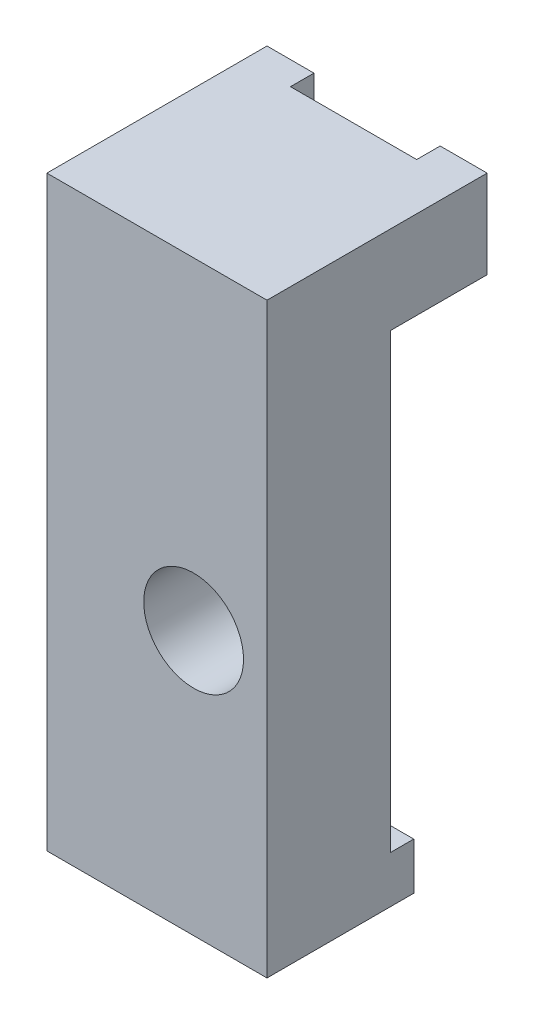
ISO-10303-21;
HEADER;
FILE_DESCRIPTION(('STEP AP214'),'2;1');
FILE_NAME('part.step','',(''),(''),'','','');
FILE_SCHEMA(('AUTOMOTIVE_DESIGN { 1 0 10303 214 1 1 1 1 }'));
ENDSEC;
DATA;
#1=APPLICATION_CONTEXT('core data for automotive mechanical design processes');
#2=APPLICATION_PROTOCOL_DEFINITION('international standard','automotive_design',2000,#1);
#3=PRODUCT_CONTEXT('',#1,'mechanical');
#4=PRODUCT('Part','Part','',(#3));
#5=PRODUCT_RELATED_PRODUCT_CATEGORY('part','',(#4));
#6=PRODUCT_DEFINITION_FORMATION('','',#4);
#7=PRODUCT_DEFINITION_CONTEXT('part definition',#1,'design');
#8=PRODUCT_DEFINITION('design','',#6,#7);
#9=PRODUCT_DEFINITION_SHAPE('','',#8);
#10=(LENGTH_UNIT() NAMED_UNIT(*) SI_UNIT(.MILLI.,.METRE.));
#11=(NAMED_UNIT(*) PLANE_ANGLE_UNIT() SI_UNIT($,.RADIAN.));
#12=(NAMED_UNIT(*) SI_UNIT($,.STERADIAN.) SOLID_ANGLE_UNIT());
#13=UNCERTAINTY_MEASURE_WITH_UNIT(LENGTH_MEASURE(1.E-05),#10,'distance_accuracy_value','');
#14=(GEOMETRIC_REPRESENTATION_CONTEXT(3) GLOBAL_UNCERTAINTY_ASSIGNED_CONTEXT((#13)) GLOBAL_UNIT_ASSIGNED_CONTEXT((#10,
#11,#12)) REPRESENTATION_CONTEXT('',''));
#15=CARTESIAN_POINT('',(0.,0.,0.));
#16=DIRECTION('',(0.,0.,1.));
#17=DIRECTION('',(1.,0.,0.));
#18=AXIS2_PLACEMENT_3D('',#15,#16,#17);
#19=CARTESIAN_POINT('',(0.,0.,-4.7625));
#20=DIRECTION('',(0.,0.,1.));
#21=DIRECTION('',(1.,0.,0.));
#22=AXIS2_PLACEMENT_3D('',#19,#20,#21);
#23=PLANE('',#22);
#24=DIRECTION('',(1.,0.,0.));
#25=VECTOR('',#24,1.);
#26=CARTESIAN_POINT('',(-4.76350000000001,8.89,-4.7625));
#27=LINE('',#26,#25);
#28=CARTESIAN_POINT('',(2.7305,8.89,-4.7625));
#29=VERTEX_POINT('',#28);
#30=CARTESIAN_POINT('',(4.7625,8.89,-4.7625));
#31=VERTEX_POINT('',#30);
#32=EDGE_CURVE('E219',#29,#31,#27,.T.);
#33=ORIENTED_EDGE('',*,*,#32,.F.);
#34=DIRECTION('',(0.,1.,0.));
#35=VECTOR('',#34,1.);
#36=CARTESIAN_POINT('',(2.7305,-12.701,-4.7625));
#37=LINE('',#36,#35);
#38=CARTESIAN_POINT('',(2.7305,12.7,-4.7625));
#39=VERTEX_POINT('',#38);
#40=EDGE_CURVE('E193',#29,#39,#37,.T.);
#41=ORIENTED_EDGE('',*,*,#40,.T.);
#42=DIRECTION('',(-1.,0.,0.));
#43=VECTOR('',#42,1.);
#44=CARTESIAN_POINT('',(-4.7625,12.7,-4.7625));
#45=LINE('',#44,#43);
#46=CARTESIAN_POINT('',(4.7625,12.7,-4.7625));
#47=VERTEX_POINT('',#46);
#48=EDGE_CURVE('E243',#47,#39,#45,.T.);
#49=ORIENTED_EDGE('',*,*,#48,.F.);
#50=DIRECTION('',(0.,1.,0.));
#51=VECTOR('',#50,1.);
#52=CARTESIAN_POINT('',(4.7625,12.7,-4.7625));
#53=LINE('',#52,#51);
#54=EDGE_CURVE('E138',#31,#47,#53,.T.);
#55=ORIENTED_EDGE('',*,*,#54,.F.);
#56=EDGE_LOOP('',(#33,#41,#49,#55));
#57=FACE_BOUND('',#56,.T.);
#58=ADVANCED_FACE('F38',(#57),#23,.F.);
#59=CARTESIAN_POINT('',(4.7625,12.7,4.7625));
#60=DIRECTION('',(-1.,0.,0.));
#61=DIRECTION('',(0.,-1.,0.));
#62=AXIS2_PLACEMENT_3D('',#59,#60,#61);
#63=PLANE('',#62);
#64=DIRECTION('',(0.,-1.,0.));
#65=VECTOR('',#64,1.);
#66=CARTESIAN_POINT('',(4.7625,-12.7,-1.5875));
#67=LINE('',#66,#65);
#68=CARTESIAN_POINT('',(4.7625,-10.668,-1.5875));
#69=VERTEX_POINT('',#68);
#70=CARTESIAN_POINT('',(4.7625,-12.7,-1.5875));
#71=VERTEX_POINT('',#70);
#72=EDGE_CURVE('E216',#69,#71,#67,.T.);
#73=ORIENTED_EDGE('',*,*,#72,.F.);
#74=DIRECTION('',(0.,0.,-1.));
#75=VECTOR('',#74,1.);
#76=CARTESIAN_POINT('',(4.7625,-10.668,-1.5875));
#77=LINE('',#76,#75);
#78=CARTESIAN_POINT('',(4.7625,-10.668,-0.5715));
#79=VERTEX_POINT('',#78);
#80=EDGE_CURVE('E157',#79,#69,#77,.T.);
#81=ORIENTED_EDGE('',*,*,#80,.F.);
#82=DIRECTION('',(0.,-1.,0.));
#83=VECTOR('',#82,1.);
#84=CARTESIAN_POINT('',(4.7625,-10.668,-0.5715));
#85=LINE('',#84,#83);
#86=CARTESIAN_POINT('',(4.7625,8.89,-0.5715));
#87=VERTEX_POINT('',#86);
#88=EDGE_CURVE('E163',#87,#79,#85,.T.);
#89=ORIENTED_EDGE('',*,*,#88,.F.);
#90=DIRECTION('',(0.,0.,1.));
#91=VECTOR('',#90,1.);
#92=CARTESIAN_POINT('',(4.7625,8.89,-4.7625));
#93=LINE('',#92,#91);
#94=EDGE_CURVE('E145',#31,#87,#93,.T.);
#95=ORIENTED_EDGE('',*,*,#94,.F.);
#96=ORIENTED_EDGE('',*,*,#54,.T.);
#97=DIRECTION('',(0.,0.,-1.));
#98=VECTOR('',#97,1.);
#99=CARTESIAN_POINT('',(4.7625,12.7,4.7625));
#100=LINE('',#99,#98);
#101=CARTESIAN_POINT('',(4.7625,12.7,4.7625));
#102=VERTEX_POINT('',#101);
#103=EDGE_CURVE('E11',#102,#47,#100,.T.);
#104=ORIENTED_EDGE('',*,*,#103,.F.);
#105=DIRECTION('',(0.,1.,0.));
#106=VECTOR('',#105,1.);
#107=CARTESIAN_POINT('',(4.7625,12.7,4.7625));
#108=LINE('',#107,#106);
#109=CARTESIAN_POINT('',(4.7625,-12.7,4.7625));
#110=VERTEX_POINT('',#109);
#111=EDGE_CURVE('E226',#110,#102,#108,.T.);
#112=ORIENTED_EDGE('',*,*,#111,.F.);
#113=DIRECTION('',(0.,0.,-1.));
#114=VECTOR('',#113,1.);
#115=CARTESIAN_POINT('',(4.7625,-12.7,4.7625));
#116=LINE('',#115,#114);
#117=EDGE_CURVE('E239',#110,#71,#116,.T.);
#118=ORIENTED_EDGE('',*,*,#117,.T.);
#119=EDGE_LOOP('',(#73,#81,#89,#95,#96,#104,#112,#118));
#120=FACE_BOUND('',#119,.T.);
#121=ADVANCED_FACE('F40',(#120),#63,.F.);
#122=CARTESIAN_POINT('',(-4.7625,12.7,4.7625));
#123=DIRECTION('',(0.,-1.,0.));
#124=DIRECTION('',(0.,0.,-1.));
#125=AXIS2_PLACEMENT_3D('',#122,#123,#124);
#126=PLANE('',#125);
#127=ORIENTED_EDGE('',*,*,#48,.T.);
#128=DIRECTION('',(0.,0.,-1.));
#129=VECTOR('',#128,1.);
#130=CARTESIAN_POINT('',(2.7305,12.7,-4.7625));
#131=LINE('',#130,#129);
#132=CARTESIAN_POINT('',(2.7305,12.7,-3.7465));
#133=VERTEX_POINT('',#132);
#134=EDGE_CURVE('E182',#133,#39,#131,.T.);
#135=ORIENTED_EDGE('',*,*,#134,.F.);
#136=DIRECTION('',(1.,0.,0.));
#137=VECTOR('',#136,1.);
#138=CARTESIAN_POINT('',(2.7305,12.7,-3.7465));
#139=LINE('',#138,#137);
#140=CARTESIAN_POINT('',(-2.7305,12.7,-3.7465));
#141=VERTEX_POINT('',#140);
#142=EDGE_CURVE('E189',#141,#133,#139,.T.);
#143=ORIENTED_EDGE('',*,*,#142,.F.);
#144=DIRECTION('',(0.,0.,1.));
#145=VECTOR('',#144,1.);
#146=CARTESIAN_POINT('',(-2.7305,12.7,-4.7625));
#147=LINE('',#146,#145);
#148=CARTESIAN_POINT('',(-2.7305,12.7,-4.7625));
#149=VERTEX_POINT('',#148);
#150=EDGE_CURVE('E185',#149,#141,#147,.T.);
#151=ORIENTED_EDGE('',*,*,#150,.F.);
#152=CARTESIAN_POINT('',(-4.7625,12.7,-4.7625));
#153=VERTEX_POINT('',#152);
#154=EDGE_CURVE('E242',#149,#153,#45,.T.);
#155=ORIENTED_EDGE('',*,*,#154,.T.);
#156=DIRECTION('',(0.,0.,-1.));
#157=VECTOR('',#156,1.);
#158=CARTESIAN_POINT('',(-4.7625,12.7,4.7625));
#159=LINE('',#158,#157);
#160=CARTESIAN_POINT('',(-4.7625,12.7,4.7625));
#161=VERTEX_POINT('',#160);
#162=EDGE_CURVE('E48',#161,#153,#159,.T.);
#163=ORIENTED_EDGE('',*,*,#162,.F.);
#164=DIRECTION('',(-1.,0.,0.));
#165=VECTOR('',#164,1.);
#166=CARTESIAN_POINT('',(-4.7625,12.7,4.7625));
#167=LINE('',#166,#165);
#168=EDGE_CURVE('E230',#102,#161,#167,.T.);
#169=ORIENTED_EDGE('',*,*,#168,.F.);
#170=ORIENTED_EDGE('',*,*,#103,.T.);
#171=EDGE_LOOP('',(#127,#135,#143,#151,#155,#163,#169,#170));
#172=FACE_BOUND('',#171,.T.);
#173=ADVANCED_FACE('F273',(#172),#126,.F.);
#174=CARTESIAN_POINT('',(-4.7625,12.7,4.7625));
#175=DIRECTION('',(1.,0.,0.));
#176=DIRECTION('',(0.,1.,0.));
#177=AXIS2_PLACEMENT_3D('',#174,#175,#176);
#178=PLANE('',#177);
#179=DIRECTION('',(0.,-1.,0.));
#180=VECTOR('',#179,1.);
#181=CARTESIAN_POINT('',(-4.7625,-10.668,-0.5715));
#182=LINE('',#181,#180);
#183=CARTESIAN_POINT('',(-4.76250000000001,8.89,-0.5715));
#184=VERTEX_POINT('',#183);
#185=CARTESIAN_POINT('',(-4.7625,-10.668,-0.5715));
#186=VERTEX_POINT('',#185);
#187=EDGE_CURVE('E133',#184,#186,#182,.T.);
#188=ORIENTED_EDGE('',*,*,#187,.T.);
#189=DIRECTION('',(0.,0.,-1.));
#190=VECTOR('',#189,1.);
#191=CARTESIAN_POINT('',(-4.7625,-10.668,-1.5875));
#192=LINE('',#191,#190);
#193=CARTESIAN_POINT('',(-4.7625,-10.668,-1.5875));
#194=VERTEX_POINT('',#193);
#195=EDGE_CURVE('E151',#186,#194,#192,.T.);
#196=ORIENTED_EDGE('',*,*,#195,.T.);
#197=DIRECTION('',(0.,1.,0.));
#198=VECTOR('',#197,1.);
#199=CARTESIAN_POINT('',(-4.7625,-12.7,-1.5875));
#200=LINE('',#199,#198);
#201=CARTESIAN_POINT('',(-4.7625,-12.7,-1.5875));
#202=VERTEX_POINT('',#201);
#203=EDGE_CURVE('E210',#202,#194,#200,.T.);
#204=ORIENTED_EDGE('',*,*,#203,.F.);
#205=DIRECTION('',(0.,0.,-1.));
#206=VECTOR('',#205,1.);
#207=CARTESIAN_POINT('',(-4.7625,-12.7,4.7625));
#208=LINE('',#207,#206);
#209=CARTESIAN_POINT('',(-4.7625,-12.7,4.7625));
#210=VERTEX_POINT('',#209);
#211=EDGE_CURVE('E252',#210,#202,#208,.T.);
#212=ORIENTED_EDGE('',*,*,#211,.F.);
#213=DIRECTION('',(0.,-1.,0.));
#214=VECTOR('',#213,1.);
#215=CARTESIAN_POINT('',(-4.7625,12.7,4.7625));
#216=LINE('',#215,#214);
#217=EDGE_CURVE('E233',#161,#210,#216,.T.);
#218=ORIENTED_EDGE('',*,*,#217,.F.);
#219=ORIENTED_EDGE('',*,*,#162,.T.);
#220=DIRECTION('',(0.,-1.,0.));
#221=VECTOR('',#220,1.);
#222=CARTESIAN_POINT('',(-4.7625,12.7,-4.7625));
#223=LINE('',#222,#221);
#224=CARTESIAN_POINT('',(-4.7625,8.89,-4.7625));
#225=VERTEX_POINT('',#224);
#226=EDGE_CURVE('E136',#153,#225,#223,.T.);
#227=ORIENTED_EDGE('',*,*,#226,.T.);
#228=DIRECTION('',(0.,0.,-1.));
#229=VECTOR('',#228,1.);
#230=CARTESIAN_POINT('',(-4.7625,8.89,-4.7625));
#231=LINE('',#230,#229);
#232=EDGE_CURVE('E63',#184,#225,#231,.T.);
#233=ORIENTED_EDGE('',*,*,#232,.F.);
#234=EDGE_LOOP('',(#188,#196,#204,#212,#218,#219,#227,#233));
#235=FACE_BOUND('',#234,.T.);
#236=ADVANCED_FACE('F130',(#235),#178,.F.);
#237=CARTESIAN_POINT('',(-4.7625,-12.7,4.7625));
#238=DIRECTION('',(0.,1.,0.));
#239=DIRECTION('',(0.,0.,1.));
#240=AXIS2_PLACEMENT_3D('',#237,#238,#239);
#241=PLANE('',#240);
#242=ORIENTED_EDGE('',*,*,#211,.T.);
#243=DIRECTION('',(1.,0.,0.));
#244=VECTOR('',#243,1.);
#245=CARTESIAN_POINT('',(-4.7635,-12.7,-1.5875));
#246=LINE('',#245,#244);
#247=EDGE_CURVE('E139',#202,#71,#246,.T.);
#248=ORIENTED_EDGE('',*,*,#247,.T.);
#249=ORIENTED_EDGE('',*,*,#117,.F.);
#250=DIRECTION('',(1.,0.,0.));
#251=VECTOR('',#250,1.);
#252=CARTESIAN_POINT('',(-4.7625,-12.7,4.7625));
#253=LINE('',#252,#251);
#254=EDGE_CURVE('E236',#210,#110,#253,.T.);
#255=ORIENTED_EDGE('',*,*,#254,.F.);
#256=EDGE_LOOP('',(#242,#248,#249,#255));
#257=FACE_BOUND('',#256,.T.);
#258=ADVANCED_FACE('F316',(#257),#241,.F.);
#259=CARTESIAN_POINT('',(0.,0.,4.7625));
#260=DIRECTION('',(0.,0.,1.));
#261=DIRECTION('',(1.,0.,0.));
#262=AXIS2_PLACEMENT_3D('',#259,#260,#261);
#263=PLANE('',#262);
#264=CARTESIAN_POINT('',(1.5875,-1.27,4.7625));
#265=DIRECTION('',(0.,0.,1.));
#266=DIRECTION('',(1.,0.,0.));
#267=AXIS2_PLACEMENT_3D('',#264,#265,#266);
#268=CIRCLE('',#267,2.159);
#269=CARTESIAN_POINT('',(3.7465,-1.27,4.7625));
#270=VERTEX_POINT('',#269);
#271=EDGE_CURVE('E197',#270,#270,#268,.T.);
#272=ORIENTED_EDGE('',*,*,#271,.F.);
#273=EDGE_LOOP('',(#272));
#274=FACE_BOUND('',#273,.T.);
#275=ORIENTED_EDGE('',*,*,#111,.T.);
#276=ORIENTED_EDGE('',*,*,#168,.T.);
#277=ORIENTED_EDGE('',*,*,#217,.T.);
#278=ORIENTED_EDGE('',*,*,#254,.T.);
#279=EDGE_LOOP('',(#275,#276,#277,#278));
#280=FACE_BOUND('',#279,.T.);
#281=ADVANCED_FACE('F309',(#274,#280),#263,.T.);
#282=ORIENTED_EDGE('',*,*,#154,.F.);
#283=DIRECTION('',(0.,1.,0.));
#284=VECTOR('',#283,1.);
#285=CARTESIAN_POINT('',(-2.7305,-12.701,-4.7625));
#286=LINE('',#285,#284);
#287=CARTESIAN_POINT('',(-2.7305,8.88999999999999,-4.7625));
#288=VERTEX_POINT('',#287);
#289=EDGE_CURVE('E201',#288,#149,#286,.T.);
#290=ORIENTED_EDGE('',*,*,#289,.F.);
#291=EDGE_CURVE('E223',#225,#288,#27,.T.);
#292=ORIENTED_EDGE('',*,*,#291,.F.);
#293=ORIENTED_EDGE('',*,*,#226,.F.);
#294=EDGE_LOOP('',(#282,#290,#292,#293));
#295=FACE_BOUND('',#294,.T.);
#296=ADVANCED_FACE('F263',(#295),#23,.F.);
#297=CARTESIAN_POINT('',(-4.7635,-12.7,-1.5875));
#298=DIRECTION('',(0.,0.,1.));
#299=DIRECTION('',(1.,0.,0.));
#300=AXIS2_PLACEMENT_3D('',#297,#298,#299);
#301=PLANE('',#300);
#302=ORIENTED_EDGE('',*,*,#203,.T.);
#303=DIRECTION('',(1.,0.,0.));
#304=VECTOR('',#303,1.);
#305=CARTESIAN_POINT('',(-4.7625,-10.668,-1.5875));
#306=LINE('',#305,#304);
#307=EDGE_CURVE('E168',#194,#69,#306,.T.);
#308=ORIENTED_EDGE('',*,*,#307,.T.);
#309=ORIENTED_EDGE('',*,*,#72,.T.);
#310=ORIENTED_EDGE('',*,*,#247,.F.);
#311=EDGE_LOOP('',(#302,#308,#309,#310));
#312=FACE_BOUND('',#311,.T.);
#313=ADVANCED_FACE('F308',(#312),#301,.F.);
#314=CARTESIAN_POINT('',(-4.76350000000001,8.89,-4.7625));
#315=DIRECTION('',(0.,1.,0.));
#316=DIRECTION('',(0.,0.,1.));
#317=AXIS2_PLACEMENT_3D('',#314,#315,#316);
#318=PLANE('',#317);
#319=DIRECTION('',(-1.,0.,0.));
#320=VECTOR('',#319,1.);
#321=CARTESIAN_POINT('',(2.73049999999999,8.89,-3.7465));
#322=LINE('',#321,#320);
#323=CARTESIAN_POINT('',(2.7305,8.88999999999999,-3.7465));
#324=VERTEX_POINT('',#323);
#325=CARTESIAN_POINT('',(-2.7305,8.89,-3.7465));
#326=VERTEX_POINT('',#325);
#327=EDGE_CURVE('E55',#324,#326,#322,.T.);
#328=ORIENTED_EDGE('',*,*,#327,.F.);
#329=DIRECTION('',(0.,0.,1.));
#330=VECTOR('',#329,1.);
#331=CARTESIAN_POINT('',(2.7305,8.89,-4.76249999999999));
#332=LINE('',#331,#330);
#333=EDGE_CURVE('E178',#29,#324,#332,.T.);
#334=ORIENTED_EDGE('',*,*,#333,.F.);
#335=ORIENTED_EDGE('',*,*,#32,.T.);
#336=ORIENTED_EDGE('',*,*,#94,.T.);
#337=DIRECTION('',(1.,0.,0.));
#338=VECTOR('',#337,1.);
#339=CARTESIAN_POINT('',(-4.76250000000001,8.89,-0.5715));
#340=LINE('',#339,#338);
#341=EDGE_CURVE('E142',#184,#87,#340,.T.);
#342=ORIENTED_EDGE('',*,*,#341,.F.);
#343=ORIENTED_EDGE('',*,*,#232,.T.);
#344=ORIENTED_EDGE('',*,*,#291,.T.);
#345=DIRECTION('',(0.,0.,-1.));
#346=VECTOR('',#345,1.);
#347=CARTESIAN_POINT('',(-2.7305,8.89,-4.76249999999999));
#348=LINE('',#347,#346);
#349=EDGE_CURVE('E173',#326,#288,#348,.T.);
#350=ORIENTED_EDGE('',*,*,#349,.F.);
#351=EDGE_LOOP('',(#328,#334,#335,#336,#342,#343,#344,#350));
#352=FACE_BOUND('',#351,.T.);
#353=ADVANCED_FACE('F143',(#352),#318,.F.);
#354=CARTESIAN_POINT('',(1.5875,-1.27,-4.7635));
#355=DIRECTION('',(0.,0.,1.));
#356=DIRECTION('',(1.,0.,0.));
#357=AXIS2_PLACEMENT_3D('',#354,#355,#356);
#358=CYLINDRICAL_SURFACE('',#357,2.159);
#359=CARTESIAN_POINT('',(1.5875,-1.27,-0.5715));
#360=DIRECTION('',(0.,0.,1.));
#361=DIRECTION('',(1.,0.,0.));
#362=AXIS2_PLACEMENT_3D('',#359,#360,#361);
#363=CIRCLE('',#362,2.159);
#364=CARTESIAN_POINT('',(3.7465,-1.27,-0.5715));
#365=VERTEX_POINT('',#364);
#366=EDGE_CURVE('E42',#365,#365,#363,.F.);
#367=ORIENTED_EDGE('',*,*,#366,.T.);
#368=EDGE_LOOP('',(#367));
#369=FACE_BOUND('',#368,.T.);
#370=ORIENTED_EDGE('',*,*,#271,.T.);
#371=EDGE_LOOP('',(#370));
#372=FACE_BOUND('',#371,.T.);
#373=ADVANCED_FACE('F286',(#369,#372),#358,.F.);
#374=CARTESIAN_POINT('',(2.7305,-12.701,-4.7625));
#375=DIRECTION('',(1.,0.,0.));
#376=DIRECTION('',(0.,0.,-1.));
#377=AXIS2_PLACEMENT_3D('',#374,#375,#376);
#378=PLANE('',#377);
#379=ORIENTED_EDGE('',*,*,#333,.T.);
#380=DIRECTION('',(0.,1.,0.));
#381=VECTOR('',#380,1.);
#382=CARTESIAN_POINT('',(2.7305,-12.701,-3.7465));
#383=LINE('',#382,#381);
#384=EDGE_CURVE('E194',#324,#133,#383,.T.);
#385=ORIENTED_EDGE('',*,*,#384,.T.);
#386=ORIENTED_EDGE('',*,*,#134,.T.);
#387=ORIENTED_EDGE('',*,*,#40,.F.);
#388=EDGE_LOOP('',(#379,#385,#386,#387));
#389=FACE_BOUND('',#388,.T.);
#390=ADVANCED_FACE('F276',(#389),#378,.F.);
#391=CARTESIAN_POINT('',(2.7305,-12.701,-3.7465));
#392=DIRECTION('',(0.,0.,1.));
#393=DIRECTION('',(1.,0.,0.));
#394=AXIS2_PLACEMENT_3D('',#391,#392,#393);
#395=PLANE('',#394);
#396=ORIENTED_EDGE('',*,*,#327,.T.);
#397=DIRECTION('',(0.,1.,0.));
#398=VECTOR('',#397,1.);
#399=CARTESIAN_POINT('',(-2.7305,-12.701,-3.7465));
#400=LINE('',#399,#398);
#401=EDGE_CURVE('E198',#326,#141,#400,.T.);
#402=ORIENTED_EDGE('',*,*,#401,.T.);
#403=ORIENTED_EDGE('',*,*,#142,.T.);
#404=ORIENTED_EDGE('',*,*,#384,.F.);
#405=EDGE_LOOP('',(#396,#402,#403,#404));
#406=FACE_BOUND('',#405,.T.);
#407=ADVANCED_FACE('F271',(#406),#395,.F.);
#408=CARTESIAN_POINT('',(-2.7305,-12.701,-4.7625));
#409=DIRECTION('',(-1.,0.,0.));
#410=DIRECTION('',(0.,0.,1.));
#411=AXIS2_PLACEMENT_3D('',#408,#409,#410);
#412=PLANE('',#411);
#413=ORIENTED_EDGE('',*,*,#349,.T.);
#414=ORIENTED_EDGE('',*,*,#289,.T.);
#415=ORIENTED_EDGE('',*,*,#150,.T.);
#416=ORIENTED_EDGE('',*,*,#401,.F.);
#417=EDGE_LOOP('',(#413,#414,#415,#416));
#418=FACE_BOUND('',#417,.T.);
#419=ADVANCED_FACE('F268',(#418),#412,.F.);
#420=CARTESIAN_POINT('',(-4.7625,-10.668,-0.5715));
#421=DIRECTION('',(0.,0.,1.));
#422=DIRECTION('',(1.,0.,0.));
#423=AXIS2_PLACEMENT_3D('',#420,#421,#422);
#424=PLANE('',#423);
#425=ORIENTED_EDGE('',*,*,#88,.T.);
#426=DIRECTION('',(1.,0.,0.));
#427=VECTOR('',#426,1.);
#428=CARTESIAN_POINT('',(-4.7625,-10.668,-0.5715));
#429=LINE('',#428,#427);
#430=EDGE_CURVE('E150',#186,#79,#429,.T.);
#431=ORIENTED_EDGE('',*,*,#430,.F.);
#432=ORIENTED_EDGE('',*,*,#187,.F.);
#433=ORIENTED_EDGE('',*,*,#341,.T.);
#434=EDGE_LOOP('',(#425,#431,#432,#433));
#435=FACE_BOUND('',#434,.T.);
#436=ORIENTED_EDGE('',*,*,#366,.F.);
#437=EDGE_LOOP('',(#436));
#438=FACE_BOUND('',#437,.T.);
#439=ADVANCED_FACE('F153',(#435,#438),#424,.F.);
#440=CARTESIAN_POINT('',(-4.7625,-10.668,-1.5875));
#441=DIRECTION('',(0.,-1.,0.));
#442=DIRECTION('',(1.,0.,0.));
#443=AXIS2_PLACEMENT_3D('',#440,#441,#442);
#444=PLANE('',#443);
#445=ORIENTED_EDGE('',*,*,#80,.T.);
#446=ORIENTED_EDGE('',*,*,#307,.F.);
#447=ORIENTED_EDGE('',*,*,#195,.F.);
#448=ORIENTED_EDGE('',*,*,#430,.T.);
#449=EDGE_LOOP('',(#445,#446,#447,#448));
#450=FACE_BOUND('',#449,.T.);
#451=ADVANCED_FACE('F289',(#450),#444,.F.);
#452=CLOSED_SHELL('',(#58,#121,#173,#236,#258,#281,#296,#313,#353,#373,#390,#407,#419,#439,#451));
#453=MANIFOLD_SOLID_BREP('B2',#452);
#454=ADVANCED_BREP_SHAPE_REPRESENTATION('',(#18,#453),#14);
#455=SHAPE_DEFINITION_REPRESENTATION(#9,#454);
ENDSEC;
END-ISO-10303-21;
